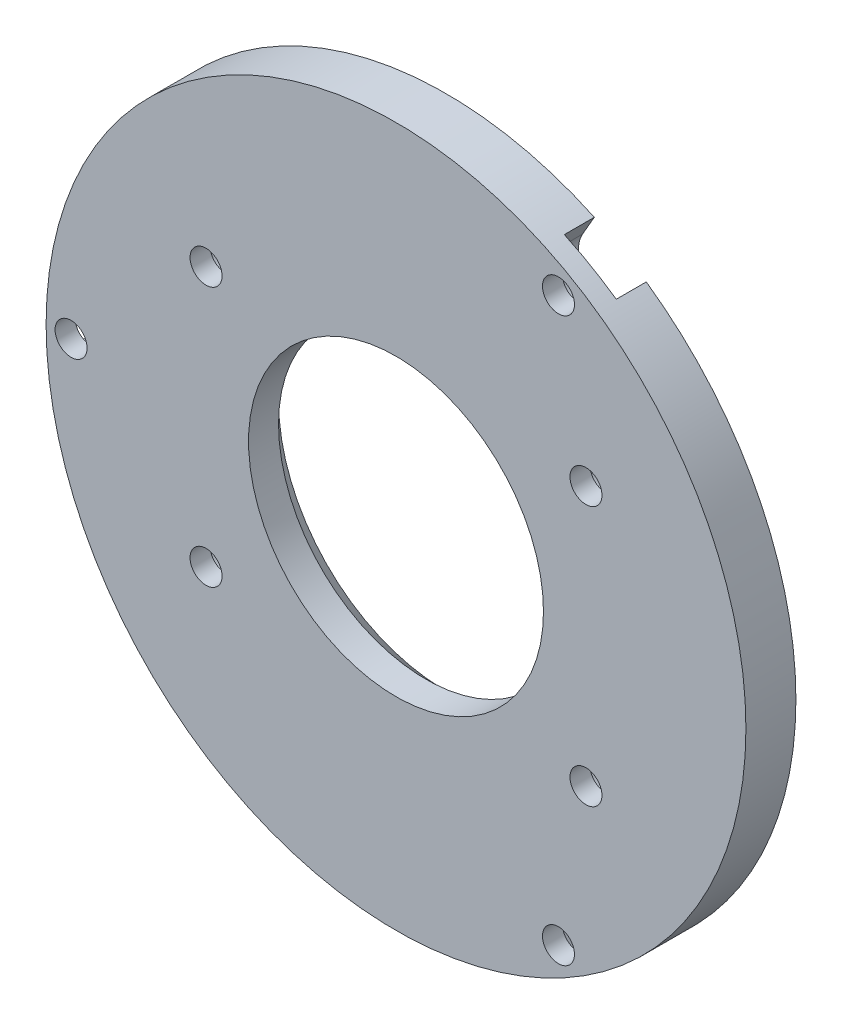
ISO-10303-21;
HEADER;
FILE_DESCRIPTION(('STEP AP214'),'2;1');
FILE_NAME('part.step','',(''),(''),'','','');
FILE_SCHEMA(('AUTOMOTIVE_DESIGN { 1 0 10303 214 1 1 1 1 }'));
ENDSEC;
DATA;
#1=APPLICATION_CONTEXT('core data for automotive mechanical design processes');
#2=APPLICATION_PROTOCOL_DEFINITION('international standard','automotive_design',2000,#1);
#3=PRODUCT_CONTEXT('',#1,'mechanical');
#4=PRODUCT('Part','Part','',(#3));
#5=PRODUCT_RELATED_PRODUCT_CATEGORY('part','',(#4));
#6=PRODUCT_DEFINITION_FORMATION('','',#4);
#7=PRODUCT_DEFINITION_CONTEXT('part definition',#1,'design');
#8=PRODUCT_DEFINITION('design','',#6,#7);
#9=PRODUCT_DEFINITION_SHAPE('','',#8);
#10=(LENGTH_UNIT() NAMED_UNIT(*) SI_UNIT(.MILLI.,.METRE.));
#11=(NAMED_UNIT(*) PLANE_ANGLE_UNIT() SI_UNIT($,.RADIAN.));
#12=(NAMED_UNIT(*) SI_UNIT($,.STERADIAN.) SOLID_ANGLE_UNIT());
#13=UNCERTAINTY_MEASURE_WITH_UNIT(LENGTH_MEASURE(1.E-05),#10,'distance_accuracy_value','');
#14=(GEOMETRIC_REPRESENTATION_CONTEXT(3) GLOBAL_UNCERTAINTY_ASSIGNED_CONTEXT((#13)) GLOBAL_UNIT_ASSIGNED_CONTEXT((#10,
#11,#12)) REPRESENTATION_CONTEXT('',''));
#15=CARTESIAN_POINT('',(0.,0.,0.));
#16=DIRECTION('',(0.,0.,1.));
#17=DIRECTION('',(1.,0.,0.));
#18=AXIS2_PLACEMENT_3D('',#15,#16,#17);
#19=CARTESIAN_POINT('',(19.,13.,1.5));
#20=DIRECTION('',(0.,0.,-1.));
#21=DIRECTION('',(-1.,0.,0.));
#22=AXIS2_PLACEMENT_3D('',#19,#20,#21);
#23=CYLINDRICAL_SURFACE('',#22,3.);
#24=CARTESIAN_POINT('',(19.,13.,3.));
#25=DIRECTION('',(0.,0.,-1.));
#26=DIRECTION('',(-1.,0.,0.));
#27=AXIS2_PLACEMENT_3D('',#24,#25,#26);
#28=CIRCLE('',#27,3.);
#29=CARTESIAN_POINT('',(16.,13.,3.));
#30=VERTEX_POINT('',#29);
#31=EDGE_CURVE('E243',#30,#30,#28,.T.);
#32=ORIENTED_EDGE('',*,*,#31,.F.);
#33=EDGE_LOOP('',(#32));
#34=FACE_BOUND('',#33,.T.);
#35=CARTESIAN_POINT('',(19.,13.,0.));
#36=DIRECTION('',(0.,0.,-1.));
#37=DIRECTION('',(-1.,0.,0.));
#38=AXIS2_PLACEMENT_3D('',#35,#36,#37);
#39=CIRCLE('',#38,3.);
#40=CARTESIAN_POINT('',(16.,13.,0.));
#41=VERTEX_POINT('',#40);
#42=EDGE_CURVE('E159',#41,#41,#39,.F.);
#43=ORIENTED_EDGE('',*,*,#42,.F.);
#44=EDGE_LOOP('',(#43));
#45=FACE_BOUND('',#44,.T.);
#46=ADVANCED_FACE('F17',(#34,#45),#23,.F.);
#47=CARTESIAN_POINT('',(19.,-13.,1.5));
#48=DIRECTION('',(0.,0.,-1.));
#49=DIRECTION('',(-1.,0.,0.));
#50=AXIS2_PLACEMENT_3D('',#47,#48,#49);
#51=CYLINDRICAL_SURFACE('',#50,3.);
#52=CARTESIAN_POINT('',(19.,-13.,3.));
#53=DIRECTION('',(0.,0.,-1.));
#54=DIRECTION('',(-1.,0.,0.));
#55=AXIS2_PLACEMENT_3D('',#52,#53,#54);
#56=CIRCLE('',#55,3.);
#57=CARTESIAN_POINT('',(16.,-13.,3.));
#58=VERTEX_POINT('',#57);
#59=EDGE_CURVE('E240',#58,#58,#56,.T.);
#60=ORIENTED_EDGE('',*,*,#59,.F.);
#61=EDGE_LOOP('',(#60));
#62=FACE_BOUND('',#61,.T.);
#63=CARTESIAN_POINT('',(19.,-13.,0.));
#64=DIRECTION('',(0.,0.,-1.));
#65=DIRECTION('',(-1.,0.,0.));
#66=AXIS2_PLACEMENT_3D('',#63,#64,#65);
#67=CIRCLE('',#66,3.);
#68=CARTESIAN_POINT('',(16.,-13.,0.));
#69=VERTEX_POINT('',#68);
#70=EDGE_CURVE('E248',#69,#69,#67,.F.);
#71=ORIENTED_EDGE('',*,*,#70,.F.);
#72=EDGE_LOOP('',(#71));
#73=FACE_BOUND('',#72,.T.);
#74=ADVANCED_FACE('F397',(#62,#73),#51,.F.);
#75=CARTESIAN_POINT('',(-19.,-13.,1.5));
#76=DIRECTION('',(0.,0.,-1.));
#77=DIRECTION('',(-1.,0.,0.));
#78=AXIS2_PLACEMENT_3D('',#75,#76,#77);
#79=CYLINDRICAL_SURFACE('',#78,3.);
#80=CARTESIAN_POINT('',(-19.,-13.,3.));
#81=DIRECTION('',(0.,0.,-1.));
#82=DIRECTION('',(-1.,0.,0.));
#83=AXIS2_PLACEMENT_3D('',#80,#81,#82);
#84=CIRCLE('',#83,3.);
#85=CARTESIAN_POINT('',(-22.,-13.,3.));
#86=VERTEX_POINT('',#85);
#87=EDGE_CURVE('E237',#86,#86,#84,.T.);
#88=ORIENTED_EDGE('',*,*,#87,.F.);
#89=EDGE_LOOP('',(#88));
#90=FACE_BOUND('',#89,.T.);
#91=CARTESIAN_POINT('',(-19.,-13.,0.));
#92=DIRECTION('',(0.,0.,-1.));
#93=DIRECTION('',(-1.,0.,0.));
#94=AXIS2_PLACEMENT_3D('',#91,#92,#93);
#95=CIRCLE('',#94,3.);
#96=CARTESIAN_POINT('',(-22.,-13.,0.));
#97=VERTEX_POINT('',#96);
#98=EDGE_CURVE('E251',#97,#97,#95,.F.);
#99=ORIENTED_EDGE('',*,*,#98,.F.);
#100=EDGE_LOOP('',(#99));
#101=FACE_BOUND('',#100,.T.);
#102=ADVANCED_FACE('F394',(#90,#101),#79,.F.);
#103=CARTESIAN_POINT('',(-32.5,0.,1.5));
#104=DIRECTION('',(0.,0.,-1.));
#105=DIRECTION('',(-1.,0.,0.));
#106=AXIS2_PLACEMENT_3D('',#103,#104,#105);
#107=CYLINDRICAL_SURFACE('',#106,3.);
#108=CARTESIAN_POINT('',(-32.5,0.,0.));
#109=DIRECTION('',(0.,0.,-1.));
#110=DIRECTION('',(-1.,0.,0.));
#111=AXIS2_PLACEMENT_3D('',#108,#109,#110);
#112=CIRCLE('',#111,3.);
#113=CARTESIAN_POINT('',(-32.5,-3.,0.));
#114=VERTEX_POINT('',#113);
#115=CARTESIAN_POINT('',(-32.5,3.,0.));
#116=VERTEX_POINT('',#115);
#117=EDGE_CURVE('E130',#114,#116,#112,.F.);
#118=ORIENTED_EDGE('',*,*,#117,.F.);
#119=DIRECTION('',(0.,0.,-1.));
#120=VECTOR('',#119,1.);
#121=CARTESIAN_POINT('',(-32.5,-3.,0.));
#122=LINE('',#121,#120);
#123=CARTESIAN_POINT('',(-32.5,-3.,3.));
#124=VERTEX_POINT('',#123);
#125=EDGE_CURVE('E123',#114,#124,#122,.F.);
#126=ORIENTED_EDGE('',*,*,#125,.T.);
#127=CARTESIAN_POINT('',(-32.5,0.,3.));
#128=DIRECTION('',(0.,0.,-1.));
#129=DIRECTION('',(-1.,0.,0.));
#130=AXIS2_PLACEMENT_3D('',#127,#128,#129);
#131=CIRCLE('',#130,3.);
#132=CARTESIAN_POINT('',(-32.5,3.,3.));
#133=VERTEX_POINT('',#132);
#134=EDGE_CURVE('E234',#133,#124,#131,.T.);
#135=ORIENTED_EDGE('',*,*,#134,.F.);
#136=DIRECTION('',(0.,0.,1.));
#137=VECTOR('',#136,1.);
#138=CARTESIAN_POINT('',(-32.5,3.,0.));
#139=LINE('',#138,#137);
#140=EDGE_CURVE('E154',#133,#116,#139,.F.);
#141=ORIENTED_EDGE('',*,*,#140,.T.);
#142=EDGE_LOOP('',(#118,#126,#135,#141));
#143=FACE_BOUND('',#142,.T.);
#144=ADVANCED_FACE('F390',(#143),#107,.F.);
#145=CARTESIAN_POINT('',(-19.,13.,1.5));
#146=DIRECTION('',(0.,0.,-1.));
#147=DIRECTION('',(-1.,0.,0.));
#148=AXIS2_PLACEMENT_3D('',#145,#146,#147);
#149=CYLINDRICAL_SURFACE('',#148,3.);
#150=CARTESIAN_POINT('',(-19.,13.,3.));
#151=DIRECTION('',(0.,0.,-1.));
#152=DIRECTION('',(-1.,0.,0.));
#153=AXIS2_PLACEMENT_3D('',#150,#151,#152);
#154=CIRCLE('',#153,3.);
#155=CARTESIAN_POINT('',(-22.,13.,3.));
#156=VERTEX_POINT('',#155);
#157=EDGE_CURVE('E230',#156,#156,#154,.T.);
#158=ORIENTED_EDGE('',*,*,#157,.F.);
#159=EDGE_LOOP('',(#158));
#160=FACE_BOUND('',#159,.T.);
#161=CARTESIAN_POINT('',(-19.,13.,0.));
#162=DIRECTION('',(0.,0.,-1.));
#163=DIRECTION('',(-1.,0.,0.));
#164=AXIS2_PLACEMENT_3D('',#161,#162,#163);
#165=CIRCLE('',#164,3.);
#166=CARTESIAN_POINT('',(-22.,13.,0.));
#167=VERTEX_POINT('',#166);
#168=EDGE_CURVE('E254',#167,#167,#165,.F.);
#169=ORIENTED_EDGE('',*,*,#168,.F.);
#170=EDGE_LOOP('',(#169));
#171=FACE_BOUND('',#170,.T.);
#172=ADVANCED_FACE('F387',(#160,#171),#149,.F.);
#173=CARTESIAN_POINT('',(16.25,-28.1458256229942,1.5));
#174=DIRECTION('',(0.,0.,-1.));
#175=DIRECTION('',(-1.,0.,0.));
#176=AXIS2_PLACEMENT_3D('',#173,#174,#175);
#177=CYLINDRICAL_SURFACE('',#176,3.);
#178=CARTESIAN_POINT('',(16.25,-28.1458256229942,3.));
#179=DIRECTION('',(0.,0.,-1.));
#180=DIRECTION('',(-1.,0.,0.));
#181=AXIS2_PLACEMENT_3D('',#178,#179,#180);
#182=CIRCLE('',#181,3.);
#183=CARTESIAN_POINT('',(13.6519237886467,-29.6458256229943,3.));
#184=VERTEX_POINT('',#183);
#185=CARTESIAN_POINT('',(18.8480762113533,-26.6458256229942,3.));
#186=VERTEX_POINT('',#185);
#187=EDGE_CURVE('E227',#184,#186,#182,.T.);
#188=ORIENTED_EDGE('',*,*,#187,.F.);
#189=DIRECTION('',(0.,0.,1.));
#190=VECTOR('',#189,1.);
#191=CARTESIAN_POINT('',(13.6519237886467,-29.6458256229943,0.));
#192=LINE('',#191,#190);
#193=CARTESIAN_POINT('',(13.6519237886467,-29.6458256229943,0.));
#194=VERTEX_POINT('',#193);
#195=EDGE_CURVE('E127',#184,#194,#192,.F.);
#196=ORIENTED_EDGE('',*,*,#195,.T.);
#197=CARTESIAN_POINT('',(16.25,-28.1458256229942,0.));
#198=DIRECTION('',(0.,0.,-1.));
#199=DIRECTION('',(-1.,0.,0.));
#200=AXIS2_PLACEMENT_3D('',#197,#198,#199);
#201=CIRCLE('',#200,3.);
#202=CARTESIAN_POINT('',(18.8480762113533,-26.6458256229942,0.));
#203=VERTEX_POINT('',#202);
#204=EDGE_CURVE('E20',#203,#194,#201,.F.);
#205=ORIENTED_EDGE('',*,*,#204,.F.);
#206=DIRECTION('',(0.,0.,1.));
#207=VECTOR('',#206,1.);
#208=CARTESIAN_POINT('',(18.8480762113533,-26.6458256229943,0.));
#209=LINE('',#208,#207);
#210=EDGE_CURVE('E104',#203,#186,#209,.T.);
#211=ORIENTED_EDGE('',*,*,#210,.T.);
#212=EDGE_LOOP('',(#188,#196,#205,#211));
#213=FACE_BOUND('',#212,.T.);
#214=ADVANCED_FACE('F126',(#213),#177,.F.);
#215=CARTESIAN_POINT('',(16.25,28.1458256229943,1.5));
#216=DIRECTION('',(0.,0.,-1.));
#217=DIRECTION('',(-1.,0.,0.));
#218=AXIS2_PLACEMENT_3D('',#215,#216,#217);
#219=CYLINDRICAL_SURFACE('',#218,3.);
#220=CARTESIAN_POINT('',(16.25,28.1458256229943,3.));
#221=DIRECTION('',(0.,0.,-1.));
#222=DIRECTION('',(-1.,0.,0.));
#223=AXIS2_PLACEMENT_3D('',#220,#221,#222);
#224=CIRCLE('',#223,3.);
#225=CARTESIAN_POINT('',(18.8480762113533,26.6458256229943,3.));
#226=VERTEX_POINT('',#225);
#227=CARTESIAN_POINT('',(13.6519237886467,29.6458256229943,3.));
#228=VERTEX_POINT('',#227);
#229=EDGE_CURVE('E224',#226,#228,#224,.T.);
#230=ORIENTED_EDGE('',*,*,#229,.F.);
#231=DIRECTION('',(0.,0.,1.));
#232=VECTOR('',#231,1.);
#233=CARTESIAN_POINT('',(18.8480762113533,26.6458256229943,0.));
#234=LINE('',#233,#232);
#235=CARTESIAN_POINT('',(18.8480762113533,26.6458256229943,0.));
#236=VERTEX_POINT('',#235);
#237=EDGE_CURVE('E114',#226,#236,#234,.F.);
#238=ORIENTED_EDGE('',*,*,#237,.T.);
#239=CARTESIAN_POINT('',(16.25,28.1458256229943,0.));
#240=DIRECTION('',(0.,0.,-1.));
#241=DIRECTION('',(-1.,0.,0.));
#242=AXIS2_PLACEMENT_3D('',#239,#240,#241);
#243=CIRCLE('',#242,3.);
#244=CARTESIAN_POINT('',(13.6519237886467,29.6458256229943,0.));
#245=VERTEX_POINT('',#244);
#246=EDGE_CURVE('E258',#245,#236,#243,.F.);
#247=ORIENTED_EDGE('',*,*,#246,.F.);
#248=DIRECTION('',(0.,0.,1.));
#249=VECTOR('',#248,1.);
#250=CARTESIAN_POINT('',(13.6519237886467,29.6458256229943,0.));
#251=LINE('',#250,#249);
#252=EDGE_CURVE('E151',#245,#228,#251,.T.);
#253=ORIENTED_EDGE('',*,*,#252,.T.);
#254=EDGE_LOOP('',(#230,#238,#247,#253));
#255=FACE_BOUND('',#254,.T.);
#256=ADVANCED_FACE('F381',(#255),#219,.F.);
#257=CARTESIAN_POINT('',(18.8480762113533,-26.6458256229943,0.));
#258=DIRECTION('',(0.866025403784438,0.500000000000001,0.));
#259=DIRECTION('',(-0.500000000000001,0.866025403784438,0.));
#260=AXIS2_PLACEMENT_3D('',#257,#258,#259);
#261=PLANE('',#260);
#262=DIRECTION('',(0.500000000000001,-0.866025403784438,0.));
#263=VECTOR('',#262,1.);
#264=CARTESIAN_POINT('',(18.8480762113533,-26.6458256229943,3.));
#265=LINE('',#264,#263);
#266=CARTESIAN_POINT('',(20.033671985516,-28.699337741083,3.));
#267=VERTEX_POINT('',#266);
#268=EDGE_CURVE('E110',#186,#267,#265,.T.);
#269=ORIENTED_EDGE('',*,*,#268,.F.);
#270=ORIENTED_EDGE('',*,*,#210,.F.);
#271=DIRECTION('',(-0.500000000000001,0.866025403784438,0.));
#272=VECTOR('',#271,1.);
#273=CARTESIAN_POINT('',(20.033671985516,-28.699337741083,0.));
#274=LINE('',#273,#272);
#275=CARTESIAN_POINT('',(20.033671985516,-28.699337741083,0.));
#276=VERTEX_POINT('',#275);
#277=EDGE_CURVE('E108',#276,#203,#274,.T.);
#278=ORIENTED_EDGE('',*,*,#277,.F.);
#279=DIRECTION('',(0.,0.,1.));
#280=VECTOR('',#279,1.);
#281=CARTESIAN_POINT('',(20.033671985516,-28.699337741083,0.));
#282=LINE('',#281,#280);
#283=EDGE_CURVE('E219',#267,#276,#282,.F.);
#284=ORIENTED_EDGE('',*,*,#283,.F.);
#285=EDGE_LOOP('',(#269,#270,#278,#284));
#286=FACE_BOUND('',#285,.T.);
#287=ADVANCED_FACE('F106',(#286),#261,.F.);
#288=CARTESIAN_POINT('',(22.9859103089132,33.812764513259,0.));
#289=DIRECTION('',(0.866025403784439,-0.5,0.));
#290=DIRECTION('',(0.5,0.866025403784439,0.));
#291=AXIS2_PLACEMENT_3D('',#288,#289,#290);
#292=PLANE('',#291);
#293=DIRECTION('',(0.499999999999999,0.866025403784439,0.));
#294=VECTOR('',#293,1.);
#295=CARTESIAN_POINT('',(18.8480762113533,26.6458256229943,0.));
#296=LINE('',#295,#294);
#297=CARTESIAN_POINT('',(20.033671985516,28.699337741083,0.));
#298=VERTEX_POINT('',#297);
#299=EDGE_CURVE('E257',#236,#298,#296,.T.);
#300=ORIENTED_EDGE('',*,*,#299,.F.);
#301=ORIENTED_EDGE('',*,*,#237,.F.);
#302=DIRECTION('',(-0.499999999999998,-0.866025403784439,0.));
#303=VECTOR('',#302,1.);
#304=CARTESIAN_POINT('',(20.033671985516,28.699337741083,3.));
#305=LINE('',#304,#303);
#306=CARTESIAN_POINT('',(20.033671985516,28.699337741083,3.));
#307=VERTEX_POINT('',#306);
#308=EDGE_CURVE('E226',#307,#226,#305,.T.);
#309=ORIENTED_EDGE('',*,*,#308,.F.);
#310=DIRECTION('',(0.,0.,1.));
#311=VECTOR('',#310,1.);
#312=CARTESIAN_POINT('',(20.033671985516,28.699337741083,0.));
#313=LINE('',#312,#311);
#314=EDGE_CURVE('E149',#298,#307,#313,.T.);
#315=ORIENTED_EDGE('',*,*,#314,.F.);
#316=EDGE_LOOP('',(#300,#301,#309,#315));
#317=FACE_BOUND('',#316,.T.);
#318=ADVANCED_FACE('F374',(#317),#292,.F.);
#319=CARTESIAN_POINT('',(13.6519237886467,29.6458256229943,0.));
#320=DIRECTION('',(-0.866025403784439,0.5,0.));
#321=DIRECTION('',(-0.5,-0.866025403784439,0.));
#322=AXIS2_PLACEMENT_3D('',#319,#320,#321);
#323=PLANE('',#322);
#324=DIRECTION('',(0.499999999999998,0.866025403784439,0.));
#325=VECTOR('',#324,1.);
#326=CARTESIAN_POINT('',(13.6519237886467,29.6458256229943,3.));
#327=LINE('',#326,#325);
#328=CARTESIAN_POINT('',(14.8375195628094,31.699337741083,3.));
#329=VERTEX_POINT('',#328);
#330=EDGE_CURVE('E223',#228,#329,#327,.T.);
#331=ORIENTED_EDGE('',*,*,#330,.F.);
#332=ORIENTED_EDGE('',*,*,#252,.F.);
#333=DIRECTION('',(-0.5,-0.866025403784439,0.));
#334=VECTOR('',#333,1.);
#335=CARTESIAN_POINT('',(14.8375195628094,31.699337741083,0.));
#336=LINE('',#335,#334);
#337=CARTESIAN_POINT('',(14.8375195628094,31.699337741083,0.));
#338=VERTEX_POINT('',#337);
#339=EDGE_CURVE('E259',#338,#245,#336,.T.);
#340=ORIENTED_EDGE('',*,*,#339,.F.);
#341=DIRECTION('',(0.,0.,1.));
#342=VECTOR('',#341,1.);
#343=CARTESIAN_POINT('',(14.8375195628094,31.699337741083,0.));
#344=LINE('',#343,#342);
#345=EDGE_CURVE('E146',#329,#338,#344,.F.);
#346=ORIENTED_EDGE('',*,*,#345,.F.);
#347=EDGE_LOOP('',(#331,#332,#340,#346));
#348=FACE_BOUND('',#347,.T.);
#349=ADVANCED_FACE('F370',(#348),#323,.F.);
#350=CARTESIAN_POINT('',(-40.7756681951199,3.,0.));
#351=DIRECTION('',(0.,1.,0.));
#352=DIRECTION('',(0.,0.,1.));
#353=AXIS2_PLACEMENT_3D('',#350,#351,#352);
#354=PLANE('',#353);
#355=DIRECTION('',(-1.,0.,0.));
#356=VECTOR('',#355,1.);
#357=CARTESIAN_POINT('',(0.,3.,0.));
#358=LINE('',#357,#356);
#359=CARTESIAN_POINT('',(-34.8711915483254,3.,0.));
#360=VERTEX_POINT('',#359);
#361=EDGE_CURVE('E135',#116,#360,#358,.T.);
#362=ORIENTED_EDGE('',*,*,#361,.F.);
#363=ORIENTED_EDGE('',*,*,#140,.F.);
#364=DIRECTION('',(-1.,0.,0.));
#365=VECTOR('',#364,1.);
#366=CARTESIAN_POINT('',(-32.5,3.,3.));
#367=LINE('',#366,#365);
#368=CARTESIAN_POINT('',(-34.8711915483254,3.,3.));
#369=VERTEX_POINT('',#368);
#370=EDGE_CURVE('E236',#369,#133,#367,.F.);
#371=ORIENTED_EDGE('',*,*,#370,.F.);
#372=DIRECTION('',(0.,0.,1.));
#373=VECTOR('',#372,1.);
#374=CARTESIAN_POINT('',(-34.8711915483254,3.,0.));
#375=LINE('',#374,#373);
#376=EDGE_CURVE('E143',#360,#369,#375,.T.);
#377=ORIENTED_EDGE('',*,*,#376,.F.);
#378=EDGE_LOOP('',(#362,#363,#371,#377));
#379=FACE_BOUND('',#378,.T.);
#380=ADVANCED_FACE('F366',(#379),#354,.F.);
#381=CARTESIAN_POINT('',(-32.5,-3.,0.));
#382=DIRECTION('',(0.,-1.,0.));
#383=DIRECTION('',(0.,0.,-1.));
#384=AXIS2_PLACEMENT_3D('',#381,#382,#383);
#385=PLANE('',#384);
#386=DIRECTION('',(-1.,0.,0.));
#387=VECTOR('',#386,1.);
#388=CARTESIAN_POINT('',(-32.5,-3.,3.));
#389=LINE('',#388,#387);
#390=CARTESIAN_POINT('',(-34.8711915483254,-3.,3.));
#391=VERTEX_POINT('',#390);
#392=EDGE_CURVE('E233',#124,#391,#389,.T.);
#393=ORIENTED_EDGE('',*,*,#392,.F.);
#394=ORIENTED_EDGE('',*,*,#125,.F.);
#395=DIRECTION('',(-1.,0.,0.));
#396=VECTOR('',#395,1.);
#397=CARTESIAN_POINT('',(0.,-3.,0.));
#398=LINE('',#397,#396);
#399=CARTESIAN_POINT('',(-34.8711915483254,-3.,0.));
#400=VERTEX_POINT('',#399);
#401=EDGE_CURVE('E128',#400,#114,#398,.F.);
#402=ORIENTED_EDGE('',*,*,#401,.F.);
#403=DIRECTION('',(0.,0.,1.));
#404=VECTOR('',#403,1.);
#405=CARTESIAN_POINT('',(-34.8711915483254,-2.99999999999999,0.));
#406=LINE('',#405,#404);
#407=EDGE_CURVE('E139',#391,#400,#406,.F.);
#408=ORIENTED_EDGE('',*,*,#407,.F.);
#409=EDGE_LOOP('',(#393,#394,#402,#408));
#410=FACE_BOUND('',#409,.T.);
#411=ADVANCED_FACE('F362',(#410),#385,.F.);
#412=CARTESIAN_POINT('',(0.,0.,0.));
#413=DIRECTION('',(0.,0.,-1.));
#414=DIRECTION('',(-1.,0.,0.));
#415=AXIS2_PLACEMENT_3D('',#412,#413,#414);
#416=PLANE('',#415);
#417=ORIENTED_EDGE('',*,*,#42,.T.);
#418=EDGE_LOOP('',(#417));
#419=FACE_BOUND('',#418,.T.);
#420=ORIENTED_EDGE('',*,*,#70,.T.);
#421=EDGE_LOOP('',(#420));
#422=FACE_BOUND('',#421,.T.);
#423=ORIENTED_EDGE('',*,*,#98,.T.);
#424=EDGE_LOOP('',(#423));
#425=FACE_BOUND('',#424,.T.);
#426=ORIENTED_EDGE('',*,*,#168,.T.);
#427=EDGE_LOOP('',(#426));
#428=FACE_BOUND('',#427,.T.);
#429=CARTESIAN_POINT('',(0.,0.,-8.97447697753573E-10));
#430=DIRECTION('',(0.,0.,-1.));
#431=DIRECTION('',(-1.,0.,0.));
#432=AXIS2_PLACEMENT_3D('',#429,#430,#431);
#433=CIRCLE('',#432,16.7499999991026);
#434=CARTESIAN_POINT('',(-16.7499999991026,0.,-8.97447697753573E-10));
#435=VERTEX_POINT('',#434);
#436=EDGE_CURVE('E220',#435,#435,#433,.F.);
#437=ORIENTED_EDGE('',*,*,#436,.T.);
#438=EDGE_LOOP('',(#437));
#439=FACE_BOUND('',#438,.T.);
#440=ORIENTED_EDGE('',*,*,#299,.T.);
#441=CARTESIAN_POINT('',(0.,0.,0.));
#442=DIRECTION('',(0.,0.,1.));
#443=DIRECTION('',(1.,0.,0.));
#444=AXIS2_PLACEMENT_3D('',#441,#442,#443);
#445=CIRCLE('',#444,35.);
#446=EDGE_CURVE('E122',#276,#298,#445,.T.);
#447=ORIENTED_EDGE('',*,*,#446,.F.);
#448=ORIENTED_EDGE('',*,*,#277,.T.);
#449=ORIENTED_EDGE('',*,*,#204,.T.);
#450=DIRECTION('',(0.500000000000001,-0.866025403784438,0.));
#451=VECTOR('',#450,1.);
#452=CARTESIAN_POINT('',(17.7897578862066,-36.812764513259,0.));
#453=LINE('',#452,#451);
#454=CARTESIAN_POINT('',(14.8375195628094,-31.699337741083,0.));
#455=VERTEX_POINT('',#454);
#456=EDGE_CURVE('E158',#194,#455,#453,.T.);
#457=ORIENTED_EDGE('',*,*,#456,.T.);
#458=CARTESIAN_POINT('',(0.,0.,0.));
#459=DIRECTION('',(0.,0.,1.));
#460=DIRECTION('',(1.,0.,0.));
#461=AXIS2_PLACEMENT_3D('',#458,#459,#460);
#462=CIRCLE('',#461,35.);
#463=EDGE_CURVE('E141',#400,#455,#462,.T.);
#464=ORIENTED_EDGE('',*,*,#463,.F.);
#465=ORIENTED_EDGE('',*,*,#401,.T.);
#466=ORIENTED_EDGE('',*,*,#117,.T.);
#467=ORIENTED_EDGE('',*,*,#361,.T.);
#468=CARTESIAN_POINT('',(0.,0.,0.));
#469=DIRECTION('',(0.,0.,1.));
#470=DIRECTION('',(1.,0.,0.));
#471=AXIS2_PLACEMENT_3D('',#468,#469,#470);
#472=CIRCLE('',#471,35.);
#473=EDGE_CURVE('E145',#338,#360,#472,.T.);
#474=ORIENTED_EDGE('',*,*,#473,.F.);
#475=ORIENTED_EDGE('',*,*,#339,.T.);
#476=ORIENTED_EDGE('',*,*,#246,.T.);
#477=EDGE_LOOP('',(#440,#447,#448,#449,#457,#464,#465,#466,#467,#474,#475,#476));
#478=FACE_BOUND('',#477,.T.);
#479=ADVANCED_FACE('F118',(#419,#422,#425,#428,#439,#478),#416,.T.);
#480=CARTESIAN_POINT('',(17.7897578862066,-36.812764513259,0.));
#481=DIRECTION('',(-0.866025403784438,-0.500000000000001,0.));
#482=DIRECTION('',(0.500000000000001,-0.866025403784438,0.));
#483=AXIS2_PLACEMENT_3D('',#480,#481,#482);
#484=PLANE('',#483);
#485=ORIENTED_EDGE('',*,*,#456,.F.);
#486=ORIENTED_EDGE('',*,*,#195,.F.);
#487=DIRECTION('',(-0.500000000000003,0.866025403784437,0.));
#488=VECTOR('',#487,1.);
#489=CARTESIAN_POINT('',(14.8375195628094,-31.699337741083,3.));
#490=LINE('',#489,#488);
#491=CARTESIAN_POINT('',(14.8375195628094,-31.699337741083,3.));
#492=VERTEX_POINT('',#491);
#493=EDGE_CURVE('E229',#492,#184,#490,.T.);
#494=ORIENTED_EDGE('',*,*,#493,.F.);
#495=DIRECTION('',(0.,0.,1.));
#496=VECTOR('',#495,1.);
#497=CARTESIAN_POINT('',(14.8375195628094,-31.699337741083,0.));
#498=LINE('',#497,#496);
#499=EDGE_CURVE('E35',#455,#492,#498,.T.);
#500=ORIENTED_EDGE('',*,*,#499,.F.);
#501=EDGE_LOOP('',(#485,#486,#494,#500));
#502=FACE_BOUND('',#501,.T.);
#503=ADVANCED_FACE('F355',(#502),#484,.F.);
#504=CARTESIAN_POINT('',(19.,13.,3.));
#505=DIRECTION('',(0.,0.,-1.));
#506=DIRECTION('',(-1.,0.,0.));
#507=AXIS2_PLACEMENT_3D('',#504,#505,#506);
#508=PLANE('',#507);
#509=CARTESIAN_POINT('',(19.,13.,3.));
#510=DIRECTION('',(0.,0.,-1.));
#511=DIRECTION('',(-1.,0.,0.));
#512=AXIS2_PLACEMENT_3D('',#509,#510,#511);
#513=CIRCLE('',#512,1.6);
#514=CARTESIAN_POINT('',(17.4,13.,3.));
#515=VERTEX_POINT('',#514);
#516=EDGE_CURVE('E206',#515,#515,#513,.F.);
#517=ORIENTED_EDGE('',*,*,#516,.T.);
#518=EDGE_LOOP('',(#517));
#519=FACE_BOUND('',#518,.T.);
#520=ORIENTED_EDGE('',*,*,#31,.T.);
#521=EDGE_LOOP('',(#520));
#522=FACE_BOUND('',#521,.T.);
#523=ADVANCED_FACE('F351',(#519,#522),#508,.T.);
#524=CARTESIAN_POINT('',(19.,-13.,3.));
#525=DIRECTION('',(0.,0.,-1.));
#526=DIRECTION('',(-1.,0.,0.));
#527=AXIS2_PLACEMENT_3D('',#524,#525,#526);
#528=PLANE('',#527);
#529=CARTESIAN_POINT('',(19.,-13.,3.));
#530=DIRECTION('',(0.,0.,-1.));
#531=DIRECTION('',(-1.,0.,0.));
#532=AXIS2_PLACEMENT_3D('',#529,#530,#531);
#533=CIRCLE('',#532,1.6);
#534=CARTESIAN_POINT('',(17.4,-13.,3.));
#535=VERTEX_POINT('',#534);
#536=EDGE_CURVE('E203',#535,#535,#533,.F.);
#537=ORIENTED_EDGE('',*,*,#536,.T.);
#538=EDGE_LOOP('',(#537));
#539=FACE_BOUND('',#538,.T.);
#540=ORIENTED_EDGE('',*,*,#59,.T.);
#541=EDGE_LOOP('',(#540));
#542=FACE_BOUND('',#541,.T.);
#543=ADVANCED_FACE('F347',(#539,#542),#528,.T.);
#544=CARTESIAN_POINT('',(-19.,-13.,3.));
#545=DIRECTION('',(0.,0.,-1.));
#546=DIRECTION('',(-1.,0.,0.));
#547=AXIS2_PLACEMENT_3D('',#544,#545,#546);
#548=PLANE('',#547);
#549=CARTESIAN_POINT('',(-19.,-13.,3.));
#550=DIRECTION('',(0.,0.,-1.));
#551=DIRECTION('',(-1.,0.,0.));
#552=AXIS2_PLACEMENT_3D('',#549,#550,#551);
#553=CIRCLE('',#552,1.6);
#554=CARTESIAN_POINT('',(-20.6,-13.,3.));
#555=VERTEX_POINT('',#554);
#556=EDGE_CURVE('E200',#555,#555,#553,.F.);
#557=ORIENTED_EDGE('',*,*,#556,.T.);
#558=EDGE_LOOP('',(#557));
#559=FACE_BOUND('',#558,.T.);
#560=ORIENTED_EDGE('',*,*,#87,.T.);
#561=EDGE_LOOP('',(#560));
#562=FACE_BOUND('',#561,.T.);
#563=ADVANCED_FACE('F343',(#559,#562),#548,.T.);
#564=CARTESIAN_POINT('',(-32.5,0.,3.));
#565=DIRECTION('',(0.,0.,-1.));
#566=DIRECTION('',(-1.,0.,0.));
#567=AXIS2_PLACEMENT_3D('',#564,#565,#566);
#568=PLANE('',#567);
#569=CARTESIAN_POINT('',(-32.5,0.,3.));
#570=DIRECTION('',(0.,0.,-1.));
#571=DIRECTION('',(-1.,0.,0.));
#572=AXIS2_PLACEMENT_3D('',#569,#570,#571);
#573=CIRCLE('',#572,1.6);
#574=CARTESIAN_POINT('',(-34.1,0.,3.));
#575=VERTEX_POINT('',#574);
#576=EDGE_CURVE('E197',#575,#575,#573,.F.);
#577=ORIENTED_EDGE('',*,*,#576,.T.);
#578=EDGE_LOOP('',(#577));
#579=FACE_BOUND('',#578,.T.);
#580=ORIENTED_EDGE('',*,*,#134,.T.);
#581=ORIENTED_EDGE('',*,*,#392,.T.);
#582=CARTESIAN_POINT('',(0.,0.,3.));
#583=DIRECTION('',(0.,0.,1.));
#584=DIRECTION('',(1.,0.,0.));
#585=AXIS2_PLACEMENT_3D('',#582,#583,#584);
#586=CIRCLE('',#585,35.);
#587=EDGE_CURVE('E142',#369,#391,#586,.T.);
#588=ORIENTED_EDGE('',*,*,#587,.F.);
#589=ORIENTED_EDGE('',*,*,#370,.T.);
#590=EDGE_LOOP('',(#580,#581,#588,#589));
#591=FACE_BOUND('',#590,.T.);
#592=ADVANCED_FACE('F339',(#579,#591),#568,.T.);
#593=CARTESIAN_POINT('',(-19.,13.,3.));
#594=DIRECTION('',(0.,0.,-1.));
#595=DIRECTION('',(-1.,0.,0.));
#596=AXIS2_PLACEMENT_3D('',#593,#594,#595);
#597=PLANE('',#596);
#598=CARTESIAN_POINT('',(-19.,13.,3.));
#599=DIRECTION('',(0.,0.,-1.));
#600=DIRECTION('',(-1.,0.,0.));
#601=AXIS2_PLACEMENT_3D('',#598,#599,#600);
#602=CIRCLE('',#601,1.6);
#603=CARTESIAN_POINT('',(-20.6,13.,3.));
#604=VERTEX_POINT('',#603);
#605=EDGE_CURVE('E194',#604,#604,#602,.F.);
#606=ORIENTED_EDGE('',*,*,#605,.T.);
#607=EDGE_LOOP('',(#606));
#608=FACE_BOUND('',#607,.T.);
#609=ORIENTED_EDGE('',*,*,#157,.T.);
#610=EDGE_LOOP('',(#609));
#611=FACE_BOUND('',#610,.T.);
#612=ADVANCED_FACE('F335',(#608,#611),#597,.T.);
#613=CARTESIAN_POINT('',(16.25,-28.1458256229942,3.));
#614=DIRECTION('',(0.,0.,-1.));
#615=DIRECTION('',(-1.,0.,0.));
#616=AXIS2_PLACEMENT_3D('',#613,#614,#615);
#617=PLANE('',#616);
#618=CARTESIAN_POINT('',(16.25,-28.1458256229942,3.));
#619=DIRECTION('',(0.,0.,-1.));
#620=DIRECTION('',(-1.,0.,0.));
#621=AXIS2_PLACEMENT_3D('',#618,#619,#620);
#622=CIRCLE('',#621,1.6);
#623=CARTESIAN_POINT('',(14.65,-28.1458256229942,3.));
#624=VERTEX_POINT('',#623);
#625=EDGE_CURVE('E191',#624,#624,#622,.F.);
#626=ORIENTED_EDGE('',*,*,#625,.T.);
#627=EDGE_LOOP('',(#626));
#628=FACE_BOUND('',#627,.T.);
#629=ORIENTED_EDGE('',*,*,#187,.T.);
#630=ORIENTED_EDGE('',*,*,#268,.T.);
#631=CARTESIAN_POINT('',(0.,0.,3.));
#632=DIRECTION('',(0.,0.,1.));
#633=DIRECTION('',(1.,0.,0.));
#634=AXIS2_PLACEMENT_3D('',#631,#632,#633);
#635=CIRCLE('',#634,35.);
#636=EDGE_CURVE('E209',#492,#267,#635,.T.);
#637=ORIENTED_EDGE('',*,*,#636,.F.);
#638=ORIENTED_EDGE('',*,*,#493,.T.);
#639=EDGE_LOOP('',(#629,#630,#637,#638));
#640=FACE_BOUND('',#639,.T.);
#641=ADVANCED_FACE('F331',(#628,#640),#617,.T.);
#642=CARTESIAN_POINT('',(16.25,28.1458256229943,3.));
#643=DIRECTION('',(0.,0.,-1.));
#644=DIRECTION('',(-1.,0.,0.));
#645=AXIS2_PLACEMENT_3D('',#642,#643,#644);
#646=PLANE('',#645);
#647=CARTESIAN_POINT('',(16.25,28.1458256229943,3.));
#648=DIRECTION('',(0.,0.,-1.));
#649=DIRECTION('',(-1.,0.,0.));
#650=AXIS2_PLACEMENT_3D('',#647,#648,#649);
#651=CIRCLE('',#650,1.6);
#652=CARTESIAN_POINT('',(14.65,28.1458256229943,3.));
#653=VERTEX_POINT('',#652);
#654=EDGE_CURVE('E188',#653,#653,#651,.F.);
#655=ORIENTED_EDGE('',*,*,#654,.T.);
#656=EDGE_LOOP('',(#655));
#657=FACE_BOUND('',#656,.T.);
#658=ORIENTED_EDGE('',*,*,#229,.T.);
#659=ORIENTED_EDGE('',*,*,#330,.T.);
#660=CARTESIAN_POINT('',(0.,0.,3.));
#661=DIRECTION('',(0.,0.,1.));
#662=DIRECTION('',(1.,0.,0.));
#663=AXIS2_PLACEMENT_3D('',#660,#661,#662);
#664=CIRCLE('',#663,35.);
#665=EDGE_CURVE('E148',#307,#329,#664,.T.);
#666=ORIENTED_EDGE('',*,*,#665,.F.);
#667=ORIENTED_EDGE('',*,*,#308,.T.);
#668=EDGE_LOOP('',(#658,#659,#666,#667));
#669=FACE_BOUND('',#668,.T.);
#670=ADVANCED_FACE('F324',(#657,#669),#646,.T.);
#671=CARTESIAN_POINT('',(0.,0.,-8.97447047232269E-10));
#672=DIRECTION('',(0.,0.,-1.));
#673=DIRECTION('',(-1.,0.,0.));
#674=AXIS2_PLACEMENT_3D('',#671,#672,#673);
#675=CONICAL_SURFACE('',#674,16.7499999991026,0.785398162499999);
#676=ORIENTED_EDGE('',*,*,#436,.F.);
#677=EDGE_LOOP('',(#676));
#678=FACE_BOUND('',#677,.T.);
#679=CARTESIAN_POINT('',(0.,0.,2.));
#680=DIRECTION('',(0.,0.,1.));
#681=DIRECTION('',(1.,0.,0.));
#682=AXIS2_PLACEMENT_3D('',#679,#680,#681);
#683=CIRCLE('',#682,14.75);
#684=CARTESIAN_POINT('',(14.75,0.,2.));
#685=VERTEX_POINT('',#684);
#686=EDGE_CURVE('E187',#685,#685,#683,.T.);
#687=ORIENTED_EDGE('',*,*,#686,.T.);
#688=EDGE_LOOP('',(#687));
#689=FACE_BOUND('',#688,.T.);
#690=ADVANCED_FACE('F283',(#678,#689),#675,.F.);
#691=CARTESIAN_POINT('',(0.,0.,0.));
#692=DIRECTION('',(0.,0.,1.));
#693=DIRECTION('',(1.,0.,0.));
#694=AXIS2_PLACEMENT_3D('',#691,#692,#693);
#695=CYLINDRICAL_SURFACE('',#694,35.);
#696=CARTESIAN_POINT('',(0.,0.,5.));
#697=DIRECTION('',(0.,0.,1.));
#698=DIRECTION('',(1.,0.,0.));
#699=AXIS2_PLACEMENT_3D('',#696,#697,#698);
#700=CIRCLE('',#699,35.);
#701=CARTESIAN_POINT('',(35.,0.,5.));
#702=VERTEX_POINT('',#701);
#703=EDGE_CURVE('E184',#702,#702,#700,.F.);
#704=ORIENTED_EDGE('',*,*,#703,.T.);
#705=EDGE_LOOP('',(#704));
#706=FACE_BOUND('',#705,.T.);
#707=ORIENTED_EDGE('',*,*,#499,.T.);
#708=ORIENTED_EDGE('',*,*,#636,.T.);
#709=ORIENTED_EDGE('',*,*,#283,.T.);
#710=ORIENTED_EDGE('',*,*,#446,.T.);
#711=ORIENTED_EDGE('',*,*,#314,.T.);
#712=ORIENTED_EDGE('',*,*,#665,.T.);
#713=ORIENTED_EDGE('',*,*,#345,.T.);
#714=ORIENTED_EDGE('',*,*,#473,.T.);
#715=ORIENTED_EDGE('',*,*,#376,.T.);
#716=ORIENTED_EDGE('',*,*,#587,.T.);
#717=ORIENTED_EDGE('',*,*,#407,.T.);
#718=ORIENTED_EDGE('',*,*,#463,.T.);
#719=EDGE_LOOP('',(#707,#708,#709,#710,#711,#712,#713,#714,#715,#716,#717,#718));
#720=FACE_BOUND('',#719,.T.);
#721=ADVANCED_FACE('F312',(#706,#720),#695,.T.);
#722=CARTESIAN_POINT('',(19.,13.,99.121138007995));
#723=DIRECTION('',(0.,0.,-1.));
#724=DIRECTION('',(-1.,0.,0.));
#725=AXIS2_PLACEMENT_3D('',#722,#723,#724);
#726=CYLINDRICAL_SURFACE('',#725,1.6);
#727=ORIENTED_EDGE('',*,*,#516,.F.);
#728=EDGE_LOOP('',(#727));
#729=FACE_BOUND('',#728,.T.);
#730=CARTESIAN_POINT('',(19.,13.,5.));
#731=DIRECTION('',(0.,0.,-1.));
#732=DIRECTION('',(-1.,0.,0.));
#733=AXIS2_PLACEMENT_3D('',#730,#731,#732);
#734=CIRCLE('',#733,1.6);
#735=CARTESIAN_POINT('',(17.4,13.,5.));
#736=VERTEX_POINT('',#735);
#737=EDGE_CURVE('E181',#736,#736,#734,.F.);
#738=ORIENTED_EDGE('',*,*,#737,.T.);
#739=EDGE_LOOP('',(#738));
#740=FACE_BOUND('',#739,.T.);
#741=ADVANCED_FACE('F314',(#729,#740),#726,.F.);
#742=CARTESIAN_POINT('',(19.,-13.,99.121138007995));
#743=DIRECTION('',(0.,0.,-1.));
#744=DIRECTION('',(-1.,0.,0.));
#745=AXIS2_PLACEMENT_3D('',#742,#743,#744);
#746=CYLINDRICAL_SURFACE('',#745,1.6);
#747=ORIENTED_EDGE('',*,*,#536,.F.);
#748=EDGE_LOOP('',(#747));
#749=FACE_BOUND('',#748,.T.);
#750=CARTESIAN_POINT('',(19.,-13.,5.));
#751=DIRECTION('',(0.,0.,-1.));
#752=DIRECTION('',(-1.,0.,0.));
#753=AXIS2_PLACEMENT_3D('',#750,#751,#752);
#754=CIRCLE('',#753,1.6);
#755=CARTESIAN_POINT('',(17.4,-13.,5.));
#756=VERTEX_POINT('',#755);
#757=EDGE_CURVE('E178',#756,#756,#754,.F.);
#758=ORIENTED_EDGE('',*,*,#757,.T.);
#759=EDGE_LOOP('',(#758));
#760=FACE_BOUND('',#759,.T.);
#761=ADVANCED_FACE('F321',(#749,#760),#746,.F.);
#762=CARTESIAN_POINT('',(-19.,-13.,99.121138007995));
#763=DIRECTION('',(0.,0.,-1.));
#764=DIRECTION('',(-1.,0.,0.));
#765=AXIS2_PLACEMENT_3D('',#762,#763,#764);
#766=CYLINDRICAL_SURFACE('',#765,1.6);
#767=ORIENTED_EDGE('',*,*,#556,.F.);
#768=EDGE_LOOP('',(#767));
#769=FACE_BOUND('',#768,.T.);
#770=CARTESIAN_POINT('',(-19.,-13.,5.));
#771=DIRECTION('',(0.,0.,-1.));
#772=DIRECTION('',(-1.,0.,0.));
#773=AXIS2_PLACEMENT_3D('',#770,#771,#772);
#774=CIRCLE('',#773,1.6);
#775=CARTESIAN_POINT('',(-20.6,-13.,5.));
#776=VERTEX_POINT('',#775);
#777=EDGE_CURVE('E175',#776,#776,#774,.F.);
#778=ORIENTED_EDGE('',*,*,#777,.T.);
#779=EDGE_LOOP('',(#778));
#780=FACE_BOUND('',#779,.T.);
#781=ADVANCED_FACE('F572',(#769,#780),#766,.F.);
#782=CARTESIAN_POINT('',(-32.5,0.,99.121138007995));
#783=DIRECTION('',(0.,0.,-1.));
#784=DIRECTION('',(-1.,0.,0.));
#785=AXIS2_PLACEMENT_3D('',#782,#783,#784);
#786=CYLINDRICAL_SURFACE('',#785,1.6);
#787=ORIENTED_EDGE('',*,*,#576,.F.);
#788=EDGE_LOOP('',(#787));
#789=FACE_BOUND('',#788,.T.);
#790=CARTESIAN_POINT('',(-32.5,0.,5.));
#791=DIRECTION('',(0.,0.,-1.));
#792=DIRECTION('',(-1.,0.,0.));
#793=AXIS2_PLACEMENT_3D('',#790,#791,#792);
#794=CIRCLE('',#793,1.6);
#795=CARTESIAN_POINT('',(-34.1,0.,5.));
#796=VERTEX_POINT('',#795);
#797=EDGE_CURVE('E172',#796,#796,#794,.F.);
#798=ORIENTED_EDGE('',*,*,#797,.T.);
#799=EDGE_LOOP('',(#798));
#800=FACE_BOUND('',#799,.T.);
#801=ADVANCED_FACE('F581',(#789,#800),#786,.F.);
#802=CARTESIAN_POINT('',(-19.,13.,99.121138007995));
#803=DIRECTION('',(0.,0.,-1.));
#804=DIRECTION('',(-1.,0.,0.));
#805=AXIS2_PLACEMENT_3D('',#802,#803,#804);
#806=CYLINDRICAL_SURFACE('',#805,1.6);
#807=ORIENTED_EDGE('',*,*,#605,.F.);
#808=EDGE_LOOP('',(#807));
#809=FACE_BOUND('',#808,.T.);
#810=CARTESIAN_POINT('',(-19.,13.,5.));
#811=DIRECTION('',(0.,0.,-1.));
#812=DIRECTION('',(-1.,0.,0.));
#813=AXIS2_PLACEMENT_3D('',#810,#811,#812);
#814=CIRCLE('',#813,1.6);
#815=CARTESIAN_POINT('',(-20.6,13.,5.));
#816=VERTEX_POINT('',#815);
#817=EDGE_CURVE('E169',#816,#816,#814,.F.);
#818=ORIENTED_EDGE('',*,*,#817,.T.);
#819=EDGE_LOOP('',(#818));
#820=FACE_BOUND('',#819,.T.);
#821=ADVANCED_FACE('F591',(#809,#820),#806,.F.);
#822=CARTESIAN_POINT('',(16.25,-28.1458256229942,99.121138007995));
#823=DIRECTION('',(0.,0.,-1.));
#824=DIRECTION('',(-1.,0.,0.));
#825=AXIS2_PLACEMENT_3D('',#822,#823,#824);
#826=CYLINDRICAL_SURFACE('',#825,1.6);
#827=ORIENTED_EDGE('',*,*,#625,.F.);
#828=EDGE_LOOP('',(#827));
#829=FACE_BOUND('',#828,.T.);
#830=CARTESIAN_POINT('',(16.25,-28.1458256229942,5.));
#831=DIRECTION('',(0.,0.,-1.));
#832=DIRECTION('',(-1.,0.,0.));
#833=AXIS2_PLACEMENT_3D('',#830,#831,#832);
#834=CIRCLE('',#833,1.6);
#835=CARTESIAN_POINT('',(14.65,-28.1458256229942,5.));
#836=VERTEX_POINT('',#835);
#837=EDGE_CURVE('E166',#836,#836,#834,.F.);
#838=ORIENTED_EDGE('',*,*,#837,.T.);
#839=EDGE_LOOP('',(#838));
#840=FACE_BOUND('',#839,.T.);
#841=ADVANCED_FACE('F601',(#829,#840),#826,.F.);
#842=CARTESIAN_POINT('',(16.25,28.1458256229943,99.121138007995));
#843=DIRECTION('',(0.,0.,-1.));
#844=DIRECTION('',(-1.,0.,0.));
#845=AXIS2_PLACEMENT_3D('',#842,#843,#844);
#846=CYLINDRICAL_SURFACE('',#845,1.6);
#847=ORIENTED_EDGE('',*,*,#654,.F.);
#848=EDGE_LOOP('',(#847));
#849=FACE_BOUND('',#848,.T.);
#850=CARTESIAN_POINT('',(16.25,28.1458256229943,5.));
#851=DIRECTION('',(0.,0.,-1.));
#852=DIRECTION('',(-1.,0.,0.));
#853=AXIS2_PLACEMENT_3D('',#850,#851,#852);
#854=CIRCLE('',#853,1.6);
#855=CARTESIAN_POINT('',(14.65,28.1458256229943,5.));
#856=VERTEX_POINT('',#855);
#857=EDGE_CURVE('E26',#856,#856,#854,.F.);
#858=ORIENTED_EDGE('',*,*,#857,.T.);
#859=EDGE_LOOP('',(#858));
#860=FACE_BOUND('',#859,.T.);
#861=ADVANCED_FACE('F289',(#849,#860),#846,.F.);
#862=CARTESIAN_POINT('',(0.,0.,0.));
#863=DIRECTION('',(0.,0.,1.));
#864=DIRECTION('',(1.,0.,0.));
#865=AXIS2_PLACEMENT_3D('',#862,#863,#864);
#866=CYLINDRICAL_SURFACE('',#865,14.75);
#867=ORIENTED_EDGE('',*,*,#686,.F.);
#868=EDGE_LOOP('',(#867));
#869=FACE_BOUND('',#868,.T.);
#870=CARTESIAN_POINT('',(0.,0.,5.));
#871=DIRECTION('',(0.,0.,1.));
#872=DIRECTION('',(1.,0.,0.));
#873=AXIS2_PLACEMENT_3D('',#870,#871,#872);
#874=CIRCLE('',#873,14.75);
#875=CARTESIAN_POINT('',(14.75,0.,5.));
#876=VERTEX_POINT('',#875);
#877=EDGE_CURVE('E11',#876,#876,#874,.T.);
#878=ORIENTED_EDGE('',*,*,#877,.T.);
#879=EDGE_LOOP('',(#878));
#880=FACE_BOUND('',#879,.T.);
#881=ADVANCED_FACE('F285',(#869,#880),#866,.F.);
#882=CARTESIAN_POINT('',(0.,0.,5.));
#883=DIRECTION('',(0.,0.,-1.));
#884=DIRECTION('',(-1.,0.,0.));
#885=AXIS2_PLACEMENT_3D('',#882,#883,#884);
#886=PLANE('',#885);
#887=ORIENTED_EDGE('',*,*,#877,.F.);
#888=EDGE_LOOP('',(#887));
#889=FACE_BOUND('',#888,.T.);
#890=ORIENTED_EDGE('',*,*,#857,.F.);
#891=EDGE_LOOP('',(#890));
#892=FACE_BOUND('',#891,.T.);
#893=ORIENTED_EDGE('',*,*,#837,.F.);
#894=EDGE_LOOP('',(#893));
#895=FACE_BOUND('',#894,.T.);
#896=ORIENTED_EDGE('',*,*,#817,.F.);
#897=EDGE_LOOP('',(#896));
#898=FACE_BOUND('',#897,.T.);
#899=ORIENTED_EDGE('',*,*,#797,.F.);
#900=EDGE_LOOP('',(#899));
#901=FACE_BOUND('',#900,.T.);
#902=ORIENTED_EDGE('',*,*,#777,.F.);
#903=EDGE_LOOP('',(#902));
#904=FACE_BOUND('',#903,.T.);
#905=ORIENTED_EDGE('',*,*,#757,.F.);
#906=EDGE_LOOP('',(#905));
#907=FACE_BOUND('',#906,.T.);
#908=ORIENTED_EDGE('',*,*,#737,.F.);
#909=EDGE_LOOP('',(#908));
#910=FACE_BOUND('',#909,.T.);
#911=ORIENTED_EDGE('',*,*,#703,.F.);
#912=EDGE_LOOP('',(#911));
#913=FACE_BOUND('',#912,.T.);
#914=ADVANCED_FACE('F288',(#889,#892,#895,#898,#901,#904,#907,#910,#913),#886,.F.);
#915=CLOSED_SHELL('',(#46,#74,#102,#144,#172,#214,#256,#287,#318,#349,#380,#411,#479,#503,#523,
#543,#563,#592,#612,#641,#670,#690,#721,#741,#761,#781,#801,#821,#841,#861,#881,#914));
#916=MANIFOLD_SOLID_BREP('B1',#915);
#917=ADVANCED_BREP_SHAPE_REPRESENTATION('',(#18,#916),#14);
#918=SHAPE_DEFINITION_REPRESENTATION(#9,#917);
ENDSEC;
END-ISO-10303-21;
